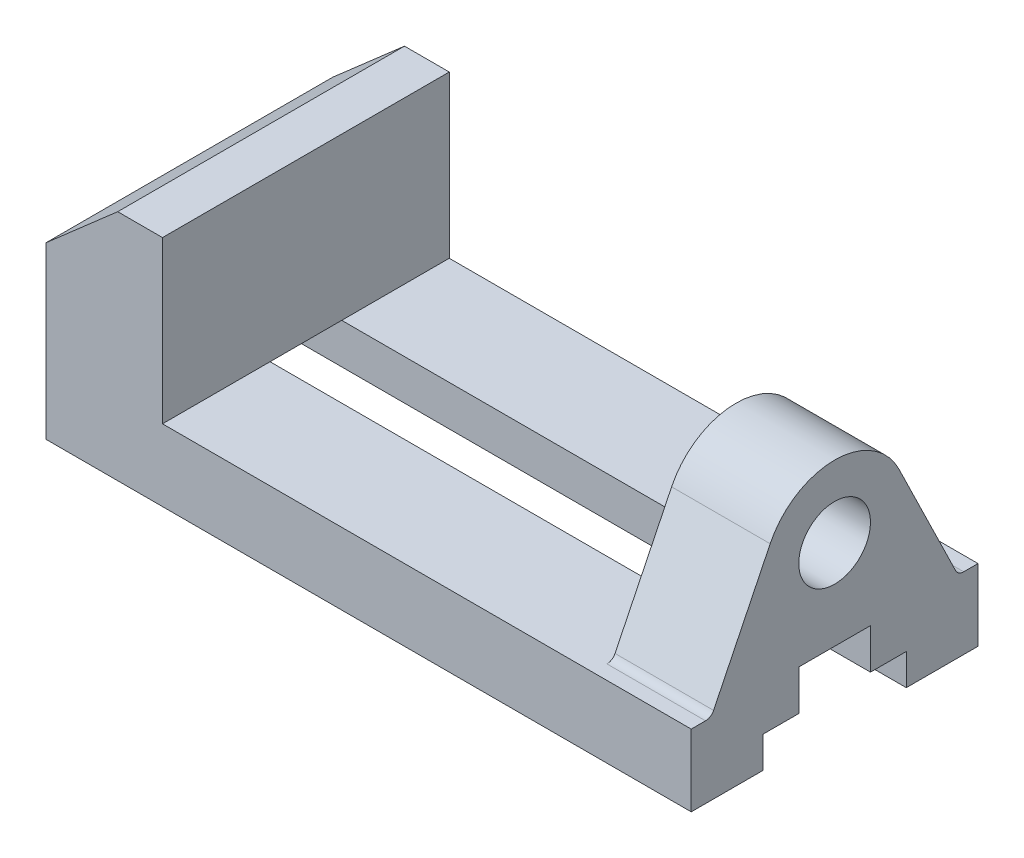
ISO-10303-21;
HEADER;
FILE_DESCRIPTION(('STEP AP214'),'2;1');
FILE_NAME('part.step','',(''),(''),'','','');
FILE_SCHEMA(('AUTOMOTIVE_DESIGN { 1 0 10303 214 1 1 1 1 }'));
ENDSEC;
DATA;
#1=APPLICATION_CONTEXT('core data for automotive mechanical design processes');
#2=APPLICATION_PROTOCOL_DEFINITION('international standard','automotive_design',2000,#1);
#3=PRODUCT_CONTEXT('',#1,'mechanical');
#4=PRODUCT('Part','Part','',(#3));
#5=PRODUCT_RELATED_PRODUCT_CATEGORY('part','',(#4));
#6=PRODUCT_DEFINITION_FORMATION('','',#4);
#7=PRODUCT_DEFINITION_CONTEXT('part definition',#1,'design');
#8=PRODUCT_DEFINITION('design','',#6,#7);
#9=PRODUCT_DEFINITION_SHAPE('','',#8);
#10=(LENGTH_UNIT() NAMED_UNIT(*) SI_UNIT(.MILLI.,.METRE.));
#11=(NAMED_UNIT(*) PLANE_ANGLE_UNIT() SI_UNIT($,.RADIAN.));
#12=(NAMED_UNIT(*) SI_UNIT($,.STERADIAN.) SOLID_ANGLE_UNIT());
#13=UNCERTAINTY_MEASURE_WITH_UNIT(LENGTH_MEASURE(1.E-05),#10,'distance_accuracy_value','');
#14=(GEOMETRIC_REPRESENTATION_CONTEXT(3) GLOBAL_UNCERTAINTY_ASSIGNED_CONTEXT((#13)) GLOBAL_UNIT_ASSIGNED_CONTEXT((#10,
#11,#12)) REPRESENTATION_CONTEXT('',''));
#15=CARTESIAN_POINT('',(0.,0.,0.));
#16=DIRECTION('',(0.,0.,1.));
#17=DIRECTION('',(1.,0.,0.));
#18=AXIS2_PLACEMENT_3D('',#15,#16,#17);
#19=CARTESIAN_POINT('',(0.,16.,0.));
#20=DIRECTION('',(0.,1.,0.));
#21=DIRECTION('',(0.,0.,1.));
#22=AXIS2_PLACEMENT_3D('',#19,#20,#21);
#23=PLANE('',#22);
#24=DIRECTION('',(1.,0.,0.));
#25=VECTOR('',#24,1.);
#26=CARTESIAN_POINT('',(-72.,16.,8.));
#27=LINE('',#26,#25);
#28=CARTESIAN_POINT('',(-46.,16.,8.));
#29=VERTEX_POINT('',#28);
#30=CARTESIAN_POINT('',(50.,16.,7.99999999999999));
#31=VERTEX_POINT('',#30);
#32=EDGE_CURVE('E60',#29,#31,#27,.T.);
#33=ORIENTED_EDGE('',*,*,#32,.F.);
#34=DIRECTION('',(0.,0.,1.));
#35=VECTOR('',#34,1.);
#36=CARTESIAN_POINT('',(-46.,16.,-32.));
#37=LINE('',#36,#35);
#38=CARTESIAN_POINT('',(-46.,16.,32.));
#39=VERTEX_POINT('',#38);
#40=EDGE_CURVE('E308',#29,#39,#37,.T.);
#41=ORIENTED_EDGE('',*,*,#40,.T.);
#42=DIRECTION('',(1.,0.,0.));
#43=VECTOR('',#42,1.);
#44=CARTESIAN_POINT('',(-72.,16.,32.));
#45=LINE('',#44,#43);
#46=CARTESIAN_POINT('',(72.,16.,32.));
#47=VERTEX_POINT('',#46);
#48=EDGE_CURVE('E334',#39,#47,#45,.T.);
#49=ORIENTED_EDGE('',*,*,#48,.T.);
#50=DIRECTION('',(0.,0.,-1.));
#51=VECTOR('',#50,1.);
#52=CARTESIAN_POINT('',(72.,16.,-32.));
#53=LINE('',#52,#51);
#54=CARTESIAN_POINT('',(72.,16.,28.8060215227388));
#55=VERTEX_POINT('',#54);
#56=EDGE_CURVE('E327',#47,#55,#53,.T.);
#57=ORIENTED_EDGE('',*,*,#56,.T.);
#58=DIRECTION('',(1.,0.,0.));
#59=VECTOR('',#58,1.);
#60=CARTESIAN_POINT('',(50.,16.,28.8060215227388));
#61=LINE('',#60,#59);
#62=CARTESIAN_POINT('',(50.,16.,28.8060215227388));
#63=VERTEX_POINT('',#62);
#64=EDGE_CURVE('E356',#55,#63,#61,.F.);
#65=ORIENTED_EDGE('',*,*,#64,.T.);
#66=DIRECTION('',(0.,0.,-1.));
#67=VECTOR('',#66,1.);
#68=CARTESIAN_POINT('',(50.,16.,-27.5562828189202));
#69=LINE('',#68,#67);
#70=EDGE_CURVE('E272',#63,#31,#69,.T.);
#71=ORIENTED_EDGE('',*,*,#70,.T.);
#72=EDGE_LOOP('',(#33,#41,#49,#57,#65,#71));
#73=FACE_BOUND('',#72,.T.);
#74=ADVANCED_FACE('F37',(#73),#23,.T.);
#75=CARTESIAN_POINT('',(0.,0.,0.));
#76=DIRECTION('',(0.,1.,0.));
#77=DIRECTION('',(0.,0.,1.));
#78=AXIS2_PLACEMENT_3D('',#75,#76,#77);
#79=PLANE('',#78);
#80=DIRECTION('',(0.,0.,1.));
#81=VECTOR('',#80,1.);
#82=CARTESIAN_POINT('',(-72.,0.,-32.));
#83=LINE('',#82,#81);
#84=CARTESIAN_POINT('',(-72.,0.,16.));
#85=VERTEX_POINT('',#84);
#86=CARTESIAN_POINT('',(-72.,0.,32.));
#87=VERTEX_POINT('',#86);
#88=EDGE_CURVE('E342',#85,#87,#83,.T.);
#89=ORIENTED_EDGE('',*,*,#88,.F.);
#90=DIRECTION('',(1.,0.,0.));
#91=VECTOR('',#90,1.);
#92=CARTESIAN_POINT('',(-72.,0.,16.));
#93=LINE('',#92,#91);
#94=CARTESIAN_POINT('',(72.,0.,16.));
#95=VERTEX_POINT('',#94);
#96=EDGE_CURVE('E246',#85,#95,#93,.T.);
#97=ORIENTED_EDGE('',*,*,#96,.T.);
#98=DIRECTION('',(0.,0.,-1.));
#99=VECTOR('',#98,1.);
#100=CARTESIAN_POINT('',(72.,0.,-32.));
#101=LINE('',#100,#99);
#102=CARTESIAN_POINT('',(72.,0.,32.));
#103=VERTEX_POINT('',#102);
#104=EDGE_CURVE('E337',#103,#95,#101,.T.);
#105=ORIENTED_EDGE('',*,*,#104,.F.);
#106=DIRECTION('',(1.,0.,0.));
#107=VECTOR('',#106,1.);
#108=CARTESIAN_POINT('',(-72.,0.,32.));
#109=LINE('',#108,#107);
#110=EDGE_CURVE('E344',#87,#103,#109,.T.);
#111=ORIENTED_EDGE('',*,*,#110,.F.);
#112=EDGE_LOOP('',(#89,#97,#105,#111));
#113=FACE_BOUND('',#112,.T.);
#114=ADVANCED_FACE('F445',(#113),#79,.F.);
#115=DIRECTION('',(1.,0.,0.));
#116=VECTOR('',#115,1.);
#117=CARTESIAN_POINT('',(-72.,16.,-8.));
#118=LINE('',#117,#116);
#119=CARTESIAN_POINT('',(-46.,16.,-8.));
#120=VERTEX_POINT('',#119);
#121=CARTESIAN_POINT('',(50.,16.,-8.));
#122=VERTEX_POINT('',#121);
#123=EDGE_CURVE('E260',#120,#122,#118,.T.);
#124=ORIENTED_EDGE('',*,*,#123,.T.);
#125=CARTESIAN_POINT('',(50.,16.,-28.8060215227388));
#126=VERTEX_POINT('',#125);
#127=EDGE_CURVE('E277',#122,#126,#69,.T.);
#128=ORIENTED_EDGE('',*,*,#127,.T.);
#129=DIRECTION('',(1.,0.,0.));
#130=VECTOR('',#129,1.);
#131=CARTESIAN_POINT('',(72.,16.,-28.8060215227388));
#132=LINE('',#131,#130);
#133=CARTESIAN_POINT('',(72.,16.,-28.8060215227388));
#134=VERTEX_POINT('',#133);
#135=EDGE_CURVE('E359',#126,#134,#132,.T.);
#136=ORIENTED_EDGE('',*,*,#135,.T.);
#137=CARTESIAN_POINT('',(72.,16.,-32.));
#138=VERTEX_POINT('',#137);
#139=EDGE_CURVE('E331',#134,#138,#53,.T.);
#140=ORIENTED_EDGE('',*,*,#139,.T.);
#141=DIRECTION('',(-1.,0.,0.));
#142=VECTOR('',#141,1.);
#143=CARTESIAN_POINT('',(-72.,16.,-32.));
#144=LINE('',#143,#142);
#145=CARTESIAN_POINT('',(-46.,16.,-32.));
#146=VERTEX_POINT('',#145);
#147=EDGE_CURVE('E330',#138,#146,#144,.T.);
#148=ORIENTED_EDGE('',*,*,#147,.T.);
#149=EDGE_CURVE('E324',#146,#120,#37,.T.);
#150=ORIENTED_EDGE('',*,*,#149,.T.);
#151=EDGE_LOOP('',(#124,#128,#136,#140,#148,#150));
#152=FACE_BOUND('',#151,.T.);
#153=ADVANCED_FACE('F405',(#152),#23,.T.);
#154=CARTESIAN_POINT('',(72.,16.,-32.));
#155=DIRECTION('',(-1.,0.,0.));
#156=DIRECTION('',(0.,0.,1.));
#157=AXIS2_PLACEMENT_3D('',#154,#155,#156);
#158=PLANE('',#157);
#159=ORIENTED_EDGE('',*,*,#104,.T.);
#160=DIRECTION('',(0.,-1.,0.));
#161=VECTOR('',#160,1.);
#162=CARTESIAN_POINT('',(72.,0.,16.));
#163=LINE('',#162,#161);
#164=CARTESIAN_POINT('',(72.,7.,16.));
#165=VERTEX_POINT('',#164);
#166=EDGE_CURVE('E215',#165,#95,#163,.T.);
#167=ORIENTED_EDGE('',*,*,#166,.F.);
#168=DIRECTION('',(0.,0.,1.));
#169=VECTOR('',#168,1.);
#170=CARTESIAN_POINT('',(72.,7.,16.));
#171=LINE('',#170,#169);
#172=CARTESIAN_POINT('',(72.,7.,8.));
#173=VERTEX_POINT('',#172);
#174=EDGE_CURVE('E217',#173,#165,#171,.T.);
#175=ORIENTED_EDGE('',*,*,#174,.F.);
#176=DIRECTION('',(0.,-1.,0.));
#177=VECTOR('',#176,1.);
#178=CARTESIAN_POINT('',(72.,7.,8.));
#179=LINE('',#178,#177);
#180=CARTESIAN_POINT('',(72.,16.,8.));
#181=VERTEX_POINT('',#180);
#182=EDGE_CURVE('E241',#181,#173,#179,.T.);
#183=ORIENTED_EDGE('',*,*,#182,.F.);
#184=DIRECTION('',(0.,0.,1.));
#185=VECTOR('',#184,1.);
#186=CARTESIAN_POINT('',(72.,16.,8.));
#187=LINE('',#186,#185);
#188=CARTESIAN_POINT('',(72.,16.,-8.));
#189=VERTEX_POINT('',#188);
#190=EDGE_CURVE('E238',#189,#181,#187,.T.);
#191=ORIENTED_EDGE('',*,*,#190,.F.);
#192=DIRECTION('',(0.,1.,0.));
#193=VECTOR('',#192,1.);
#194=CARTESIAN_POINT('',(72.,7.,-8.));
#195=LINE('',#194,#193);
#196=CARTESIAN_POINT('',(72.,7.,-8.));
#197=VERTEX_POINT('',#196);
#198=EDGE_CURVE('E235',#197,#189,#195,.T.);
#199=ORIENTED_EDGE('',*,*,#198,.F.);
#200=DIRECTION('',(0.,0.,1.));
#201=VECTOR('',#200,1.);
#202=CARTESIAN_POINT('',(72.,7.,-16.));
#203=LINE('',#202,#201);
#204=CARTESIAN_POINT('',(72.,7.,-16.));
#205=VERTEX_POINT('',#204);
#206=EDGE_CURVE('E233',#205,#197,#203,.T.);
#207=ORIENTED_EDGE('',*,*,#206,.F.);
#208=DIRECTION('',(0.,1.,0.));
#209=VECTOR('',#208,1.);
#210=CARTESIAN_POINT('',(72.,0.,-16.));
#211=LINE('',#210,#209);
#212=CARTESIAN_POINT('',(72.,0.,-16.));
#213=VERTEX_POINT('',#212);
#214=EDGE_CURVE('E194',#213,#205,#211,.T.);
#215=ORIENTED_EDGE('',*,*,#214,.F.);
#216=CARTESIAN_POINT('',(72.,0.,-32.));
#217=VERTEX_POINT('',#216);
#218=EDGE_CURVE('E319',#213,#217,#101,.T.);
#219=ORIENTED_EDGE('',*,*,#218,.T.);
#220=DIRECTION('',(0.,-1.,0.));
#221=VECTOR('',#220,1.);
#222=CARTESIAN_POINT('',(72.,16.,-32.));
#223=LINE('',#222,#221);
#224=EDGE_CURVE('E353',#138,#217,#223,.T.);
#225=ORIENTED_EDGE('',*,*,#224,.F.);
#226=ORIENTED_EDGE('',*,*,#139,.F.);
#227=CARTESIAN_POINT('',(72.,18.,-28.8060215227388));
#228=DIRECTION('',(-1.,0.,0.));
#229=DIRECTION('',(0.,0.,1.));
#230=AXIS2_PLACEMENT_3D('',#227,#228,#229);
#231=CIRCLE('',#230,2.);
#232=CARTESIAN_POINT('',(72.,17.1232577064218,-27.0084334301405));
#233=VERTEX_POINT('',#232);
#234=EDGE_CURVE('E367',#134,#233,#231,.T.);
#235=ORIENTED_EDGE('',*,*,#234,.T.);
#236=DIRECTION('',(0.,0.898794046299168,0.438371146789075));
#237=VECTOR('',#236,1.);
#238=CARTESIAN_POINT('',(72.,43.0139383486252,-14.3807047407867));
#239=LINE('',#238,#237);
#240=CARTESIAN_POINT('',(72.,43.0139383486252,-14.3807047407867));
#241=VERTEX_POINT('',#240);
#242=EDGE_CURVE('E269',#233,#241,#239,.T.);
#243=ORIENTED_EDGE('',*,*,#242,.T.);
#244=CARTESIAN_POINT('',(72.,36.,0.));
#245=DIRECTION('',(1.,0.,0.));
#246=DIRECTION('',(0.,0.,1.));
#247=AXIS2_PLACEMENT_3D('',#244,#245,#246);
#248=CIRCLE('',#247,16.);
#249=CARTESIAN_POINT('',(72.,43.0139383486252,14.3807047407867));
#250=VERTEX_POINT('',#249);
#251=EDGE_CURVE('E287',#241,#250,#248,.T.);
#252=ORIENTED_EDGE('',*,*,#251,.T.);
#253=DIRECTION('',(0.,-0.898794046299168,0.438371146789075));
#254=VECTOR('',#253,1.);
#255=CARTESIAN_POINT('',(72.,16.,27.5562828189202));
#256=LINE('',#255,#254);
#257=CARTESIAN_POINT('',(72.,17.1232577064218,27.0084334301405));
#258=VERTEX_POINT('',#257);
#259=EDGE_CURVE('E290',#250,#258,#256,.T.);
#260=ORIENTED_EDGE('',*,*,#259,.T.);
#261=CARTESIAN_POINT('',(72.,18.,28.8060215227388));
#262=DIRECTION('',(-1.,0.,0.));
#263=DIRECTION('',(0.,0.,1.));
#264=AXIS2_PLACEMENT_3D('',#261,#262,#263);
#265=CIRCLE('',#264,2.);
#266=EDGE_CURVE('E45',#258,#55,#265,.T.);
#267=ORIENTED_EDGE('',*,*,#266,.T.);
#268=ORIENTED_EDGE('',*,*,#56,.F.);
#269=DIRECTION('',(0.,-1.,0.));
#270=VECTOR('',#269,1.);
#271=CARTESIAN_POINT('',(72.,16.,32.));
#272=LINE('',#271,#270);
#273=EDGE_CURVE('E336',#47,#103,#272,.T.);
#274=ORIENTED_EDGE('',*,*,#273,.T.);
#275=EDGE_LOOP('',(#159,#167,#175,#183,#191,#199,#207,#215,#219,#225,#226,#235,#243,#252,#260,
#267,#268,#274));
#276=FACE_BOUND('',#275,.T.);
#277=CARTESIAN_POINT('',(72.,36.,0.));
#278=DIRECTION('',(1.,0.,0.));
#279=DIRECTION('',(0.,0.,-1.));
#280=AXIS2_PLACEMENT_3D('',#277,#278,#279);
#281=CIRCLE('',#280,8.);
#282=CARTESIAN_POINT('',(72.,36.,-8.));
#283=VERTEX_POINT('',#282);
#284=EDGE_CURVE('E265',#283,#283,#281,.T.);
#285=ORIENTED_EDGE('',*,*,#284,.F.);
#286=EDGE_LOOP('',(#285));
#287=FACE_BOUND('',#286,.T.);
#288=ADVANCED_FACE('F373',(#276,#287),#158,.F.);
#289=CARTESIAN_POINT('',(-72.,16.,-32.));
#290=DIRECTION('',(0.,0.,1.));
#291=DIRECTION('',(1.,0.,0.));
#292=AXIS2_PLACEMENT_3D('',#289,#290,#291);
#293=PLANE('',#292);
#294=DIRECTION('',(-1.,0.,0.));
#295=VECTOR('',#294,1.);
#296=CARTESIAN_POINT('',(-72.,0.,-32.));
#297=LINE('',#296,#295);
#298=CARTESIAN_POINT('',(-72.,0.,-32.));
#299=VERTEX_POINT('',#298);
#300=EDGE_CURVE('E340',#217,#299,#297,.T.);
#301=ORIENTED_EDGE('',*,*,#300,.T.);
#302=DIRECTION('',(0.,-1.,0.));
#303=VECTOR('',#302,1.);
#304=CARTESIAN_POINT('',(-72.,16.,-32.));
#305=LINE('',#304,#303);
#306=CARTESIAN_POINT('',(-72.,38.,-32.));
#307=VERTEX_POINT('',#306);
#308=EDGE_CURVE('E351',#307,#299,#305,.T.);
#309=ORIENTED_EDGE('',*,*,#308,.F.);
#310=DIRECTION('',(-0.752576694706878,-0.658504607868518,0.));
#311=VECTOR('',#310,1.);
#312=CARTESIAN_POINT('',(-72.,38.,-32.));
#313=LINE('',#312,#311);
#314=CARTESIAN_POINT('',(-56.,52.,-32.));
#315=VERTEX_POINT('',#314);
#316=EDGE_CURVE('E305',#315,#307,#313,.T.);
#317=ORIENTED_EDGE('',*,*,#316,.F.);
#318=DIRECTION('',(-1.,0.,0.));
#319=VECTOR('',#318,1.);
#320=CARTESIAN_POINT('',(-56.,52.,-32.));
#321=LINE('',#320,#319);
#322=CARTESIAN_POINT('',(-46.,52.,-32.));
#323=VERTEX_POINT('',#322);
#324=EDGE_CURVE('E301',#323,#315,#321,.T.);
#325=ORIENTED_EDGE('',*,*,#324,.F.);
#326=DIRECTION('',(0.,1.,0.));
#327=VECTOR('',#326,1.);
#328=CARTESIAN_POINT('',(-46.,52.,-32.));
#329=LINE('',#328,#327);
#330=EDGE_CURVE('E298',#146,#323,#329,.T.);
#331=ORIENTED_EDGE('',*,*,#330,.F.);
#332=ORIENTED_EDGE('',*,*,#147,.F.);
#333=ORIENTED_EDGE('',*,*,#224,.T.);
#334=EDGE_LOOP('',(#301,#309,#317,#325,#331,#332,#333));
#335=FACE_BOUND('',#334,.T.);
#336=ADVANCED_FACE('F412',(#335),#293,.F.);
#337=CARTESIAN_POINT('',(-72.,16.,-32.));
#338=DIRECTION('',(1.,0.,0.));
#339=DIRECTION('',(0.,0.,-1.));
#340=AXIS2_PLACEMENT_3D('',#337,#338,#339);
#341=PLANE('',#340);
#342=DIRECTION('',(0.,0.,1.));
#343=VECTOR('',#342,1.);
#344=CARTESIAN_POINT('',(-72.,7.,16.));
#345=LINE('',#344,#343);
#346=CARTESIAN_POINT('',(-72.,7.,8.));
#347=VERTEX_POINT('',#346);
#348=CARTESIAN_POINT('',(-72.,7.,16.));
#349=VERTEX_POINT('',#348);
#350=EDGE_CURVE('E227',#347,#349,#345,.T.);
#351=ORIENTED_EDGE('',*,*,#350,.T.);
#352=DIRECTION('',(0.,-1.,0.));
#353=VECTOR('',#352,1.);
#354=CARTESIAN_POINT('',(-72.,0.,16.));
#355=LINE('',#354,#353);
#356=EDGE_CURVE('E229',#349,#85,#355,.T.);
#357=ORIENTED_EDGE('',*,*,#356,.T.);
#358=ORIENTED_EDGE('',*,*,#88,.T.);
#359=DIRECTION('',(0.,-1.,0.));
#360=VECTOR('',#359,1.);
#361=CARTESIAN_POINT('',(-72.,16.,32.));
#362=LINE('',#361,#360);
#363=CARTESIAN_POINT('',(-72.,38.,32.));
#364=VERTEX_POINT('',#363);
#365=EDGE_CURVE('E348',#364,#87,#362,.T.);
#366=ORIENTED_EDGE('',*,*,#365,.F.);
#367=DIRECTION('',(0.,0.,1.));
#368=VECTOR('',#367,1.);
#369=CARTESIAN_POINT('',(-72.,38.,-32.));
#370=LINE('',#369,#368);
#371=EDGE_CURVE('E316',#307,#364,#370,.T.);
#372=ORIENTED_EDGE('',*,*,#371,.F.);
#373=ORIENTED_EDGE('',*,*,#308,.T.);
#374=CARTESIAN_POINT('',(-72.,0.,-16.));
#375=VERTEX_POINT('',#374);
#376=EDGE_CURVE('E214',#299,#375,#83,.T.);
#377=ORIENTED_EDGE('',*,*,#376,.T.);
#378=DIRECTION('',(0.,1.,0.));
#379=VECTOR('',#378,1.);
#380=CARTESIAN_POINT('',(-72.,0.,-16.));
#381=LINE('',#380,#379);
#382=CARTESIAN_POINT('',(-72.,7.,-16.));
#383=VERTEX_POINT('',#382);
#384=EDGE_CURVE('E52',#375,#383,#381,.T.);
#385=ORIENTED_EDGE('',*,*,#384,.T.);
#386=DIRECTION('',(0.,0.,1.));
#387=VECTOR('',#386,1.);
#388=CARTESIAN_POINT('',(-72.,7.,-16.));
#389=LINE('',#388,#387);
#390=CARTESIAN_POINT('',(-72.,7.,-8.));
#391=VERTEX_POINT('',#390);
#392=EDGE_CURVE('E202',#383,#391,#389,.T.);
#393=ORIENTED_EDGE('',*,*,#392,.T.);
#394=DIRECTION('',(0.,1.,0.));
#395=VECTOR('',#394,1.);
#396=CARTESIAN_POINT('',(-72.,7.,-8.));
#397=LINE('',#396,#395);
#398=CARTESIAN_POINT('',(-72.,16.,-8.));
#399=VERTEX_POINT('',#398);
#400=EDGE_CURVE('E207',#391,#399,#397,.T.);
#401=ORIENTED_EDGE('',*,*,#400,.T.);
#402=DIRECTION('',(0.,0.,1.));
#403=VECTOR('',#402,1.);
#404=CARTESIAN_POINT('',(-72.,16.,8.));
#405=LINE('',#404,#403);
#406=CARTESIAN_POINT('',(-72.,16.,8.));
#407=VERTEX_POINT('',#406);
#408=EDGE_CURVE('E221',#399,#407,#405,.T.);
#409=ORIENTED_EDGE('',*,*,#408,.T.);
#410=DIRECTION('',(0.,-1.,0.));
#411=VECTOR('',#410,1.);
#412=CARTESIAN_POINT('',(-72.,7.,8.));
#413=LINE('',#412,#411);
#414=EDGE_CURVE('E224',#407,#347,#413,.T.);
#415=ORIENTED_EDGE('',*,*,#414,.T.);
#416=EDGE_LOOP('',(#351,#357,#358,#366,#372,#373,#377,#385,#393,#401,#409,#415));
#417=FACE_BOUND('',#416,.T.);
#418=ADVANCED_FACE('F211',(#417),#341,.F.);
#419=CARTESIAN_POINT('',(-72.,16.,32.));
#420=DIRECTION('',(0.,0.,-1.));
#421=DIRECTION('',(-1.,0.,0.));
#422=AXIS2_PLACEMENT_3D('',#419,#420,#421);
#423=PLANE('',#422);
#424=ORIENTED_EDGE('',*,*,#110,.T.);
#425=ORIENTED_EDGE('',*,*,#273,.F.);
#426=ORIENTED_EDGE('',*,*,#48,.F.);
#427=DIRECTION('',(0.,1.,0.));
#428=VECTOR('',#427,1.);
#429=CARTESIAN_POINT('',(-46.,52.,32.));
#430=LINE('',#429,#428);
#431=CARTESIAN_POINT('',(-46.,52.,32.));
#432=VERTEX_POINT('',#431);
#433=EDGE_CURVE('E295',#39,#432,#430,.T.);
#434=ORIENTED_EDGE('',*,*,#433,.T.);
#435=DIRECTION('',(-1.,0.,0.));
#436=VECTOR('',#435,1.);
#437=CARTESIAN_POINT('',(-56.,52.,32.));
#438=LINE('',#437,#436);
#439=CARTESIAN_POINT('',(-56.,52.,32.));
#440=VERTEX_POINT('',#439);
#441=EDGE_CURVE('E311',#432,#440,#438,.T.);
#442=ORIENTED_EDGE('',*,*,#441,.T.);
#443=DIRECTION('',(-0.752576694706878,-0.658504607868518,0.));
#444=VECTOR('',#443,1.);
#445=CARTESIAN_POINT('',(-72.,38.,32.));
#446=LINE('',#445,#444);
#447=EDGE_CURVE('E302',#440,#364,#446,.T.);
#448=ORIENTED_EDGE('',*,*,#447,.T.);
#449=ORIENTED_EDGE('',*,*,#365,.T.);
#450=EDGE_LOOP('',(#424,#425,#426,#434,#442,#448,#449));
#451=FACE_BOUND('',#450,.T.);
#452=ADVANCED_FACE('F443',(#451),#423,.F.);
#453=ORIENTED_EDGE('',*,*,#218,.F.);
#454=DIRECTION('',(1.,0.,0.));
#455=VECTOR('',#454,1.);
#456=CARTESIAN_POINT('',(-72.,0.,-16.));
#457=LINE('',#456,#455);
#458=EDGE_CURVE('E199',#375,#213,#457,.T.);
#459=ORIENTED_EDGE('',*,*,#458,.F.);
#460=ORIENTED_EDGE('',*,*,#376,.F.);
#461=ORIENTED_EDGE('',*,*,#300,.F.);
#462=EDGE_LOOP('',(#453,#459,#460,#461));
#463=FACE_BOUND('',#462,.T.);
#464=ADVANCED_FACE('F440',(#463),#79,.F.);
#465=CARTESIAN_POINT('',(-72.,38.,-32.));
#466=DIRECTION('',(-0.658504607868518,0.752576694706878,0.));
#467=DIRECTION('',(-0.752576694706878,-0.658504607868518,0.));
#468=AXIS2_PLACEMENT_3D('',#465,#466,#467);
#469=PLANE('',#468);
#470=ORIENTED_EDGE('',*,*,#447,.F.);
#471=DIRECTION('',(0.,0.,1.));
#472=VECTOR('',#471,1.);
#473=CARTESIAN_POINT('',(-56.,52.,-32.));
#474=LINE('',#473,#472);
#475=EDGE_CURVE('E320',#315,#440,#474,.T.);
#476=ORIENTED_EDGE('',*,*,#475,.F.);
#477=ORIENTED_EDGE('',*,*,#316,.T.);
#478=ORIENTED_EDGE('',*,*,#371,.T.);
#479=EDGE_LOOP('',(#470,#476,#477,#478));
#480=FACE_BOUND('',#479,.T.);
#481=ADVANCED_FACE('F442',(#480),#469,.T.);
#482=CARTESIAN_POINT('',(-56.,52.,-32.));
#483=DIRECTION('',(0.,1.,0.));
#484=DIRECTION('',(-1.,0.,0.));
#485=AXIS2_PLACEMENT_3D('',#482,#483,#484);
#486=PLANE('',#485);
#487=ORIENTED_EDGE('',*,*,#441,.F.);
#488=DIRECTION('',(0.,0.,1.));
#489=VECTOR('',#488,1.);
#490=CARTESIAN_POINT('',(-46.,52.,-32.));
#491=LINE('',#490,#489);
#492=EDGE_CURVE('E322',#323,#432,#491,.T.);
#493=ORIENTED_EDGE('',*,*,#492,.F.);
#494=ORIENTED_EDGE('',*,*,#324,.T.);
#495=ORIENTED_EDGE('',*,*,#475,.T.);
#496=EDGE_LOOP('',(#487,#493,#494,#495));
#497=FACE_BOUND('',#496,.T.);
#498=ADVANCED_FACE('F450',(#497),#486,.T.);
#499=CARTESIAN_POINT('',(-46.,52.,-32.));
#500=DIRECTION('',(1.,0.,0.));
#501=DIRECTION('',(0.,1.,0.));
#502=AXIS2_PLACEMENT_3D('',#499,#500,#501);
#503=PLANE('',#502);
#504=ORIENTED_EDGE('',*,*,#433,.F.);
#505=ORIENTED_EDGE('',*,*,#40,.F.);
#506=DIRECTION('',(0.,0.,1.));
#507=VECTOR('',#506,1.);
#508=CARTESIAN_POINT('',(-46.,16.,-32.));
#509=LINE('',#508,#507);
#510=EDGE_CURVE('E249',#120,#29,#509,.T.);
#511=ORIENTED_EDGE('',*,*,#510,.F.);
#512=ORIENTED_EDGE('',*,*,#149,.F.);
#513=ORIENTED_EDGE('',*,*,#330,.T.);
#514=ORIENTED_EDGE('',*,*,#492,.T.);
#515=EDGE_LOOP('',(#504,#505,#511,#512,#513,#514));
#516=FACE_BOUND('',#515,.T.);
#517=ADVANCED_FACE('F418',(#516),#503,.T.);
#518=CARTESIAN_POINT('',(50.,16.,27.5562828189202));
#519=DIRECTION('',(0.,0.438371146789075,0.898794046299168));
#520=DIRECTION('',(0.,-0.898794046299168,0.438371146789075));
#521=AXIS2_PLACEMENT_3D('',#518,#519,#520);
#522=PLANE('',#521);
#523=DIRECTION('',(0.,-0.898794046299168,0.438371146789075));
#524=VECTOR('',#523,1.);
#525=CARTESIAN_POINT('',(50.,16.,27.5562828189202));
#526=LINE('',#525,#524);
#527=CARTESIAN_POINT('',(50.,43.0139383486252,14.3807047407867));
#528=VERTEX_POINT('',#527);
#529=CARTESIAN_POINT('',(50.,17.1232577064218,27.0084334301405));
#530=VERTEX_POINT('',#529);
#531=EDGE_CURVE('E282',#528,#530,#526,.T.);
#532=ORIENTED_EDGE('',*,*,#531,.T.);
#533=DIRECTION('',(1.,0.,0.));
#534=VECTOR('',#533,1.);
#535=CARTESIAN_POINT('',(72.,17.1232577064218,27.0084334301405));
#536=LINE('',#535,#534);
#537=EDGE_CURVE('E364',#530,#258,#536,.T.);
#538=ORIENTED_EDGE('',*,*,#537,.T.);
#539=ORIENTED_EDGE('',*,*,#259,.F.);
#540=DIRECTION('',(1.,0.,0.));
#541=VECTOR('',#540,1.);
#542=CARTESIAN_POINT('',(50.,43.0139383486252,14.3807047407867));
#543=LINE('',#542,#541);
#544=EDGE_CURVE('E293',#528,#250,#543,.T.);
#545=ORIENTED_EDGE('',*,*,#544,.F.);
#546=EDGE_LOOP('',(#532,#538,#539,#545));
#547=FACE_BOUND('',#546,.T.);
#548=ADVANCED_FACE('F389',(#547),#522,.T.);
#549=CARTESIAN_POINT('',(50.,36.,0.));
#550=DIRECTION('',(1.,0.,0.));
#551=DIRECTION('',(0.,0.,-1.));
#552=AXIS2_PLACEMENT_3D('',#549,#550,#551);
#553=CYLINDRICAL_SURFACE('',#552,16.);
#554=ORIENTED_EDGE('',*,*,#251,.F.);
#555=DIRECTION('',(1.,0.,0.));
#556=VECTOR('',#555,1.);
#557=CARTESIAN_POINT('',(50.,43.0139383486252,-14.3807047407867));
#558=LINE('',#557,#556);
#559=CARTESIAN_POINT('',(50.,43.0139383486252,-14.3807047407867));
#560=VERTEX_POINT('',#559);
#561=EDGE_CURVE('E285',#560,#241,#558,.T.);
#562=ORIENTED_EDGE('',*,*,#561,.F.);
#563=CARTESIAN_POINT('',(50.,36.,0.));
#564=DIRECTION('',(1.,0.,0.));
#565=DIRECTION('',(0.,0.,1.));
#566=AXIS2_PLACEMENT_3D('',#563,#564,#565);
#567=CIRCLE('',#566,16.);
#568=EDGE_CURVE('E279',#560,#528,#567,.T.);
#569=ORIENTED_EDGE('',*,*,#568,.T.);
#570=ORIENTED_EDGE('',*,*,#544,.T.);
#571=EDGE_LOOP('',(#554,#562,#569,#570));
#572=FACE_BOUND('',#571,.T.);
#573=ADVANCED_FACE('F393',(#572),#553,.T.);
#574=CARTESIAN_POINT('',(50.,43.0139383486252,-14.3807047407867));
#575=DIRECTION('',(0.,0.438371146789075,-0.898794046299168));
#576=DIRECTION('',(0.,0.898794046299168,0.438371146789075));
#577=AXIS2_PLACEMENT_3D('',#574,#575,#576);
#578=PLANE('',#577);
#579=ORIENTED_EDGE('',*,*,#242,.F.);
#580=DIRECTION('',(1.,0.,0.));
#581=VECTOR('',#580,1.);
#582=CARTESIAN_POINT('',(50.,17.1232577064218,-27.0084334301405));
#583=LINE('',#582,#581);
#584=CARTESIAN_POINT('',(50.,17.1232577064218,-27.0084334301405));
#585=VERTEX_POINT('',#584);
#586=EDGE_CURVE('E362',#233,#585,#583,.F.);
#587=ORIENTED_EDGE('',*,*,#586,.T.);
#588=DIRECTION('',(0.,0.898794046299168,0.438371146789075));
#589=VECTOR('',#588,1.);
#590=CARTESIAN_POINT('',(50.,43.0139383486252,-14.3807047407867));
#591=LINE('',#590,#589);
#592=EDGE_CURVE('E275',#585,#560,#591,.T.);
#593=ORIENTED_EDGE('',*,*,#592,.T.);
#594=ORIENTED_EDGE('',*,*,#561,.T.);
#595=EDGE_LOOP('',(#579,#587,#593,#594));
#596=FACE_BOUND('',#595,.T.);
#597=ADVANCED_FACE('F483',(#596),#578,.T.);
#598=CARTESIAN_POINT('',(50.,36.,0.));
#599=DIRECTION('',(-1.,0.,0.));
#600=DIRECTION('',(0.,0.,1.));
#601=AXIS2_PLACEMENT_3D('',#598,#599,#600);
#602=PLANE('',#601);
#603=CARTESIAN_POINT('',(50.,36.,0.));
#604=DIRECTION('',(1.,0.,0.));
#605=DIRECTION('',(0.,0.,-1.));
#606=AXIS2_PLACEMENT_3D('',#603,#604,#605);
#607=CIRCLE('',#606,8.);
#608=CARTESIAN_POINT('',(50.,36.,-8.));
#609=VERTEX_POINT('',#608);
#610=EDGE_CURVE('E266',#609,#609,#607,.T.);
#611=ORIENTED_EDGE('',*,*,#610,.T.);
#612=EDGE_LOOP('',(#611));
#613=FACE_BOUND('',#612,.T.);
#614=ORIENTED_EDGE('',*,*,#70,.F.);
#615=CARTESIAN_POINT('',(50.,18.,28.8060215227388));
#616=DIRECTION('',(-1.,0.,0.));
#617=DIRECTION('',(0.,0.,1.));
#618=AXIS2_PLACEMENT_3D('',#615,#616,#617);
#619=CIRCLE('',#618,2.);
#620=EDGE_CURVE('E11',#63,#530,#619,.F.);
#621=ORIENTED_EDGE('',*,*,#620,.T.);
#622=ORIENTED_EDGE('',*,*,#531,.F.);
#623=ORIENTED_EDGE('',*,*,#568,.F.);
#624=ORIENTED_EDGE('',*,*,#592,.F.);
#625=CARTESIAN_POINT('',(50.,18.,-28.8060215227388));
#626=DIRECTION('',(-1.,0.,0.));
#627=DIRECTION('',(0.,0.,1.));
#628=AXIS2_PLACEMENT_3D('',#625,#626,#627);
#629=CIRCLE('',#628,2.);
#630=EDGE_CURVE('E369',#585,#126,#629,.F.);
#631=ORIENTED_EDGE('',*,*,#630,.T.);
#632=ORIENTED_EDGE('',*,*,#127,.F.);
#633=EDGE_CURVE('E276',#31,#122,#69,.T.);
#634=ORIENTED_EDGE('',*,*,#633,.F.);
#635=EDGE_LOOP('',(#614,#621,#622,#623,#624,#631,#632,#634));
#636=FACE_BOUND('',#635,.T.);
#637=ADVANCED_FACE('F385',(#613,#636),#602,.T.);
#638=CARTESIAN_POINT('',(50.,36.,0.));
#639=DIRECTION('',(1.,0.,0.));
#640=DIRECTION('',(0.,0.,-1.));
#641=AXIS2_PLACEMENT_3D('',#638,#639,#640);
#642=CYLINDRICAL_SURFACE('',#641,8.);
#643=ORIENTED_EDGE('',*,*,#610,.F.);
#644=EDGE_LOOP('',(#643));
#645=FACE_BOUND('',#644,.T.);
#646=ORIENTED_EDGE('',*,*,#284,.T.);
#647=EDGE_LOOP('',(#646));
#648=FACE_BOUND('',#647,.T.);
#649=ADVANCED_FACE('F473',(#645,#648),#642,.F.);
#650=CARTESIAN_POINT('',(0.,18.,-28.8060215227388));
#651=DIRECTION('',(-1.,0.,0.));
#652=DIRECTION('',(0.,0.,1.));
#653=AXIS2_PLACEMENT_3D('',#650,#651,#652);
#654=CYLINDRICAL_SURFACE('',#653,2.);
#655=ORIENTED_EDGE('',*,*,#630,.F.);
#656=ORIENTED_EDGE('',*,*,#586,.F.);
#657=ORIENTED_EDGE('',*,*,#234,.F.);
#658=ORIENTED_EDGE('',*,*,#135,.F.);
#659=EDGE_LOOP('',(#655,#656,#657,#658));
#660=FACE_BOUND('',#659,.T.);
#661=ADVANCED_FACE('F401',(#660),#654,.F.);
#662=CARTESIAN_POINT('',(50.,18.,28.8060215227388));
#663=DIRECTION('',(-1.,0.,0.));
#664=DIRECTION('',(0.,0.,1.));
#665=AXIS2_PLACEMENT_3D('',#662,#663,#664);
#666=CYLINDRICAL_SURFACE('',#665,2.);
#667=ORIENTED_EDGE('',*,*,#620,.F.);
#668=ORIENTED_EDGE('',*,*,#64,.F.);
#669=ORIENTED_EDGE('',*,*,#266,.F.);
#670=ORIENTED_EDGE('',*,*,#537,.F.);
#671=EDGE_LOOP('',(#667,#668,#669,#670));
#672=FACE_BOUND('',#671,.T.);
#673=ADVANCED_FACE('F39',(#672),#666,.F.);
#674=CARTESIAN_POINT('',(-72.,16.,8.));
#675=DIRECTION('',(0.,1.,0.));
#676=DIRECTION('',(0.,0.,1.));
#677=AXIS2_PLACEMENT_3D('',#674,#675,#676);
#678=PLANE('',#677);
#679=ORIENTED_EDGE('',*,*,#510,.T.);
#680=EDGE_CURVE('E254',#407,#29,#27,.T.);
#681=ORIENTED_EDGE('',*,*,#680,.F.);
#682=ORIENTED_EDGE('',*,*,#408,.F.);
#683=EDGE_CURVE('E257',#399,#120,#118,.T.);
#684=ORIENTED_EDGE('',*,*,#683,.T.);
#685=EDGE_LOOP('',(#679,#681,#682,#684));
#686=FACE_BOUND('',#685,.T.);
#687=ADVANCED_FACE('F421',(#686),#678,.F.);
#688=CARTESIAN_POINT('',(-72.,0.,16.));
#689=DIRECTION('',(0.,0.,1.));
#690=DIRECTION('',(1.,0.,0.));
#691=AXIS2_PLACEMENT_3D('',#688,#689,#690);
#692=PLANE('',#691);
#693=ORIENTED_EDGE('',*,*,#166,.T.);
#694=ORIENTED_EDGE('',*,*,#96,.F.);
#695=ORIENTED_EDGE('',*,*,#356,.F.);
#696=DIRECTION('',(1.,0.,0.));
#697=VECTOR('',#696,1.);
#698=CARTESIAN_POINT('',(-72.,7.,16.));
#699=LINE('',#698,#697);
#700=EDGE_CURVE('E250',#349,#165,#699,.T.);
#701=ORIENTED_EDGE('',*,*,#700,.T.);
#702=EDGE_LOOP('',(#693,#694,#695,#701));
#703=FACE_BOUND('',#702,.T.);
#704=ADVANCED_FACE('F530',(#703),#692,.F.);
#705=CARTESIAN_POINT('',(-72.,7.,16.));
#706=DIRECTION('',(0.,1.,0.));
#707=DIRECTION('',(0.,0.,1.));
#708=AXIS2_PLACEMENT_3D('',#705,#706,#707);
#709=PLANE('',#708);
#710=ORIENTED_EDGE('',*,*,#174,.T.);
#711=ORIENTED_EDGE('',*,*,#700,.F.);
#712=ORIENTED_EDGE('',*,*,#350,.F.);
#713=DIRECTION('',(1.,0.,0.));
#714=VECTOR('',#713,1.);
#715=CARTESIAN_POINT('',(-72.,7.,8.));
#716=LINE('',#715,#714);
#717=EDGE_CURVE('E252',#347,#173,#716,.T.);
#718=ORIENTED_EDGE('',*,*,#717,.T.);
#719=EDGE_LOOP('',(#710,#711,#712,#718));
#720=FACE_BOUND('',#719,.T.);
#721=ADVANCED_FACE('F434',(#720),#709,.F.);
#722=CARTESIAN_POINT('',(-72.,7.,8.));
#723=DIRECTION('',(0.,0.,1.));
#724=DIRECTION('',(1.,0.,0.));
#725=AXIS2_PLACEMENT_3D('',#722,#723,#724);
#726=PLANE('',#725);
#727=ORIENTED_EDGE('',*,*,#182,.T.);
#728=ORIENTED_EDGE('',*,*,#717,.F.);
#729=ORIENTED_EDGE('',*,*,#414,.F.);
#730=ORIENTED_EDGE('',*,*,#680,.T.);
#731=ORIENTED_EDGE('',*,*,#32,.T.);
#732=EDGE_CURVE('E256',#31,#181,#27,.T.);
#733=ORIENTED_EDGE('',*,*,#732,.T.);
#734=EDGE_LOOP('',(#727,#728,#729,#730,#731,#733));
#735=FACE_BOUND('',#734,.T.);
#736=ADVANCED_FACE('F424',(#735),#726,.F.);
#737=ORIENTED_EDGE('',*,*,#633,.T.);
#738=EDGE_CURVE('E261',#122,#189,#118,.T.);
#739=ORIENTED_EDGE('',*,*,#738,.T.);
#740=ORIENTED_EDGE('',*,*,#190,.T.);
#741=ORIENTED_EDGE('',*,*,#732,.F.);
#742=EDGE_LOOP('',(#737,#739,#740,#741));
#743=FACE_BOUND('',#742,.T.);
#744=ADVANCED_FACE('F429',(#743),#678,.F.);
#745=CARTESIAN_POINT('',(-72.,7.,-8.));
#746=DIRECTION('',(0.,0.,-1.));
#747=DIRECTION('',(-1.,0.,0.));
#748=AXIS2_PLACEMENT_3D('',#745,#746,#747);
#749=PLANE('',#748);
#750=ORIENTED_EDGE('',*,*,#198,.T.);
#751=ORIENTED_EDGE('',*,*,#738,.F.);
#752=ORIENTED_EDGE('',*,*,#123,.F.);
#753=ORIENTED_EDGE('',*,*,#683,.F.);
#754=ORIENTED_EDGE('',*,*,#400,.F.);
#755=DIRECTION('',(1.,0.,0.));
#756=VECTOR('',#755,1.);
#757=CARTESIAN_POINT('',(-72.,7.,-8.));
#758=LINE('',#757,#756);
#759=EDGE_CURVE('E198',#391,#197,#758,.T.);
#760=ORIENTED_EDGE('',*,*,#759,.T.);
#761=EDGE_LOOP('',(#750,#751,#752,#753,#754,#760));
#762=FACE_BOUND('',#761,.T.);
#763=ADVANCED_FACE('F438',(#762),#749,.F.);
#764=CARTESIAN_POINT('',(-72.,7.,-16.));
#765=DIRECTION('',(0.,1.,0.));
#766=DIRECTION('',(0.,0.,1.));
#767=AXIS2_PLACEMENT_3D('',#764,#765,#766);
#768=PLANE('',#767);
#769=ORIENTED_EDGE('',*,*,#206,.T.);
#770=ORIENTED_EDGE('',*,*,#759,.F.);
#771=ORIENTED_EDGE('',*,*,#392,.F.);
#772=DIRECTION('',(1.,0.,0.));
#773=VECTOR('',#772,1.);
#774=CARTESIAN_POINT('',(-72.,7.,-16.));
#775=LINE('',#774,#773);
#776=EDGE_CURVE('E190',#383,#205,#775,.T.);
#777=ORIENTED_EDGE('',*,*,#776,.T.);
#778=EDGE_LOOP('',(#769,#770,#771,#777));
#779=FACE_BOUND('',#778,.T.);
#780=ADVANCED_FACE('F203',(#779),#768,.F.);
#781=CARTESIAN_POINT('',(-72.,0.,-16.));
#782=DIRECTION('',(0.,0.,-1.));
#783=DIRECTION('',(-1.,0.,0.));
#784=AXIS2_PLACEMENT_3D('',#781,#782,#783);
#785=PLANE('',#784);
#786=ORIENTED_EDGE('',*,*,#214,.T.);
#787=ORIENTED_EDGE('',*,*,#776,.F.);
#788=ORIENTED_EDGE('',*,*,#384,.F.);
#789=ORIENTED_EDGE('',*,*,#458,.T.);
#790=EDGE_LOOP('',(#786,#787,#788,#789));
#791=FACE_BOUND('',#790,.T.);
#792=ADVANCED_FACE('F192',(#791),#785,.F.);
#793=CLOSED_SHELL('',(#74,#114,#153,#288,#336,#418,#452,#464,#481,#498,#517,#548,#573,#597,#637,
#649,#661,#673,#687,#704,#721,#736,#744,#763,#780,#792));
#794=MANIFOLD_SOLID_BREP('B2',#793);
#795=ADVANCED_BREP_SHAPE_REPRESENTATION('',(#18,#794),#14);
#796=SHAPE_DEFINITION_REPRESENTATION(#9,#795);
ENDSEC;
END-ISO-10303-21;
